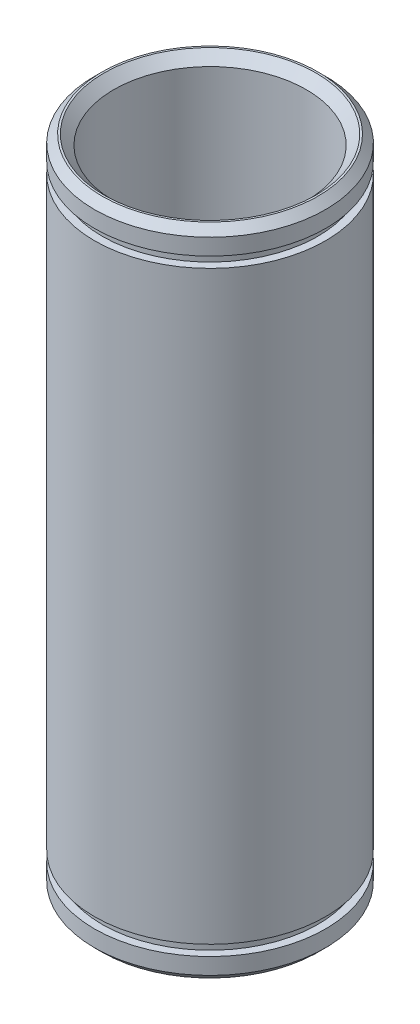
ISO-10303-21;
HEADER;
FILE_DESCRIPTION(('STEP AP214'),'2;1');
FILE_NAME('part.step','',(''),(''),'','','');
FILE_SCHEMA(('AUTOMOTIVE_DESIGN { 1 0 10303 214 1 1 1 1 }'));
ENDSEC;
DATA;
#1=APPLICATION_CONTEXT('core data for automotive mechanical design processes');
#2=APPLICATION_PROTOCOL_DEFINITION('international standard','automotive_design',2000,#1);
#3=PRODUCT_CONTEXT('',#1,'mechanical');
#4=PRODUCT('Part','Part','',(#3));
#5=PRODUCT_RELATED_PRODUCT_CATEGORY('part','',(#4));
#6=PRODUCT_DEFINITION_FORMATION('','',#4);
#7=PRODUCT_DEFINITION_CONTEXT('part definition',#1,'design');
#8=PRODUCT_DEFINITION('design','',#6,#7);
#9=PRODUCT_DEFINITION_SHAPE('','',#8);
#10=(LENGTH_UNIT() NAMED_UNIT(*) SI_UNIT(.MILLI.,.METRE.));
#11=(NAMED_UNIT(*) PLANE_ANGLE_UNIT() SI_UNIT($,.RADIAN.));
#12=(NAMED_UNIT(*) SI_UNIT($,.STERADIAN.) SOLID_ANGLE_UNIT());
#13=UNCERTAINTY_MEASURE_WITH_UNIT(LENGTH_MEASURE(1.E-05),#10,'distance_accuracy_value','');
#14=(GEOMETRIC_REPRESENTATION_CONTEXT(3) GLOBAL_UNCERTAINTY_ASSIGNED_CONTEXT((#13)) GLOBAL_UNIT_ASSIGNED_CONTEXT((#10,
#11,#12)) REPRESENTATION_CONTEXT('',''));
#15=CARTESIAN_POINT('',(0.,0.,0.));
#16=DIRECTION('',(0.,0.,1.));
#17=DIRECTION('',(1.,0.,0.));
#18=AXIS2_PLACEMENT_3D('',#15,#16,#17);
#19=CARTESIAN_POINT('',(0.,85.,0.));
#20=DIRECTION('',(0.,-1.,0.));
#21=DIRECTION('',(0.,0.,-1.));
#22=AXIS2_PLACEMENT_3D('',#19,#20,#21);
#23=CYLINDRICAL_SURFACE('',#22,15.);
#24=CARTESIAN_POINT('',(0.,80.5,0.));
#25=DIRECTION('',(0.,1.,0.));
#26=DIRECTION('',(0.,0.,1.));
#27=AXIS2_PLACEMENT_3D('',#24,#25,#26);
#28=CIRCLE('',#27,15.);
#29=CARTESIAN_POINT('',(0.,80.5,15.));
#30=VERTEX_POINT('',#29);
#31=EDGE_CURVE('E72',#30,#30,#28,.T.);
#32=ORIENTED_EDGE('',*,*,#31,.F.);
#33=EDGE_LOOP('',(#32));
#34=FACE_BOUND('',#33,.T.);
#35=CARTESIAN_POINT('',(0.,4.5,0.));
#36=DIRECTION('',(0.,1.,0.));
#37=DIRECTION('',(0.,0.,1.));
#38=AXIS2_PLACEMENT_3D('',#35,#36,#37);
#39=CIRCLE('',#38,15.);
#40=CARTESIAN_POINT('',(0.,4.5,15.));
#41=VERTEX_POINT('',#40);
#42=EDGE_CURVE('E80',#41,#41,#39,.T.);
#43=ORIENTED_EDGE('',*,*,#42,.T.);
#44=EDGE_LOOP('',(#43));
#45=FACE_BOUND('',#44,.T.);
#46=ADVANCED_FACE('F39',(#34,#45),#23,.T.);
#47=CARTESIAN_POINT('',(0.,1.00000000000001,0.));
#48=DIRECTION('',(0.,1.,0.));
#49=DIRECTION('',(0.,0.,1.));
#50=AXIS2_PLACEMENT_3D('',#47,#48,#49);
#51=CIRCLE('',#50,15.);
#52=CARTESIAN_POINT('',(0.,1.00000000000001,15.));
#53=VERTEX_POINT('',#52);
#54=EDGE_CURVE('E55',#53,#53,#51,.T.);
#55=ORIENTED_EDGE('',*,*,#54,.T.);
#56=EDGE_LOOP('',(#55));
#57=FACE_BOUND('',#56,.T.);
#58=CARTESIAN_POINT('',(0.,3.125,0.));
#59=DIRECTION('',(0.,1.,0.));
#60=DIRECTION('',(0.,0.,1.));
#61=AXIS2_PLACEMENT_3D('',#58,#59,#60);
#62=CIRCLE('',#61,15.);
#63=CARTESIAN_POINT('',(0.,3.125,15.));
#64=VERTEX_POINT('',#63);
#65=EDGE_CURVE('E85',#64,#64,#62,.T.);
#66=ORIENTED_EDGE('',*,*,#65,.F.);
#67=EDGE_LOOP('',(#66));
#68=FACE_BOUND('',#67,.T.);
#69=ADVANCED_FACE('F114',(#57,#68),#23,.T.);
#70=CARTESIAN_POINT('',(0.,85.,0.));
#71=DIRECTION('',(0.,1.,0.));
#72=DIRECTION('',(0.,0.,1.));
#73=AXIS2_PLACEMENT_3D('',#70,#71,#72);
#74=PLANE('',#73);
#75=CARTESIAN_POINT('',(0.,85.,0.));
#76=DIRECTION('',(0.,1.,0.));
#77=DIRECTION('',(0.,0.,1.));
#78=AXIS2_PLACEMENT_3D('',#75,#76,#77);
#79=CIRCLE('',#78,14.);
#80=CARTESIAN_POINT('',(0.,85.,14.));
#81=VERTEX_POINT('',#80);
#82=EDGE_CURVE('E47',#81,#81,#79,.T.);
#83=ORIENTED_EDGE('',*,*,#82,.T.);
#84=EDGE_LOOP('',(#83));
#85=FACE_BOUND('',#84,.T.);
#86=CARTESIAN_POINT('',(0.,85.,0.));
#87=DIRECTION('',(0.,1.,0.));
#88=DIRECTION('',(0.,0.,1.));
#89=AXIS2_PLACEMENT_3D('',#86,#87,#88);
#90=CIRCLE('',#89,13.75);
#91=CARTESIAN_POINT('',(0.,85.,13.75));
#92=VERTEX_POINT('',#91);
#93=EDGE_CURVE('E60',#92,#92,#90,.F.);
#94=ORIENTED_EDGE('',*,*,#93,.T.);
#95=EDGE_LOOP('',(#94));
#96=FACE_BOUND('',#95,.T.);
#97=ADVANCED_FACE('F116',(#85,#96),#74,.T.);
#98=CARTESIAN_POINT('',(0.,0.,0.));
#99=DIRECTION('',(0.,1.,0.));
#100=DIRECTION('',(0.,0.,1.));
#101=AXIS2_PLACEMENT_3D('',#98,#99,#100);
#102=PLANE('',#101);
#103=CARTESIAN_POINT('',(0.,0.,0.));
#104=DIRECTION('',(0.,1.,0.));
#105=DIRECTION('',(0.,0.,1.));
#106=AXIS2_PLACEMENT_3D('',#103,#104,#105);
#107=CIRCLE('',#106,14.);
#108=CARTESIAN_POINT('',(0.,0.,14.));
#109=VERTEX_POINT('',#108);
#110=EDGE_CURVE('E51',#109,#109,#107,.F.);
#111=ORIENTED_EDGE('',*,*,#110,.T.);
#112=EDGE_LOOP('',(#111));
#113=FACE_BOUND('',#112,.T.);
#114=CARTESIAN_POINT('',(0.,0.,0.));
#115=DIRECTION('',(0.,1.,0.));
#116=DIRECTION('',(0.,0.,1.));
#117=AXIS2_PLACEMENT_3D('',#114,#115,#116);
#118=CIRCLE('',#117,13.75);
#119=CARTESIAN_POINT('',(0.,0.,13.75));
#120=VERTEX_POINT('',#119);
#121=EDGE_CURVE('E69',#120,#120,#118,.T.);
#122=ORIENTED_EDGE('',*,*,#121,.T.);
#123=EDGE_LOOP('',(#122));
#124=FACE_BOUND('',#123,.T.);
#125=ADVANCED_FACE('F124',(#113,#124),#102,.F.);
#126=CARTESIAN_POINT('',(0.,84.,0.));
#127=DIRECTION('',(0.,1.,0.));
#128=DIRECTION('',(0.,0.,1.));
#129=AXIS2_PLACEMENT_3D('',#126,#127,#128);
#130=CIRCLE('',#129,15.);
#131=CARTESIAN_POINT('',(0.,84.,15.));
#132=VERTEX_POINT('',#131);
#133=EDGE_CURVE('E10',#132,#132,#130,.F.);
#134=ORIENTED_EDGE('',*,*,#133,.T.);
#135=EDGE_LOOP('',(#134));
#136=FACE_BOUND('',#135,.T.);
#137=CARTESIAN_POINT('',(0.,81.875,0.));
#138=DIRECTION('',(0.,1.,0.));
#139=DIRECTION('',(0.,0.,1.));
#140=AXIS2_PLACEMENT_3D('',#137,#138,#139);
#141=CIRCLE('',#140,15.);
#142=CARTESIAN_POINT('',(0.,81.875,15.));
#143=VERTEX_POINT('',#142);
#144=EDGE_CURVE('E73',#143,#143,#141,.T.);
#145=ORIENTED_EDGE('',*,*,#144,.T.);
#146=EDGE_LOOP('',(#145));
#147=FACE_BOUND('',#146,.T.);
#148=ADVANCED_FACE('F119',(#136,#147),#23,.T.);
#149=CARTESIAN_POINT('',(0.,85.,0.));
#150=DIRECTION('',(0.,-1.,0.));
#151=DIRECTION('',(0.,0.,-1.));
#152=AXIS2_PLACEMENT_3D('',#149,#150,#151);
#153=CYLINDRICAL_SURFACE('',#152,12.5);
#154=CARTESIAN_POINT('',(0.,1.25,0.));
#155=DIRECTION('',(0.,1.,0.));
#156=DIRECTION('',(0.,0.,1.));
#157=AXIS2_PLACEMENT_3D('',#154,#155,#156);
#158=CIRCLE('',#157,12.5);
#159=CARTESIAN_POINT('',(0.,1.25,12.5));
#160=VERTEX_POINT('',#159);
#161=EDGE_CURVE('E63',#160,#160,#158,.F.);
#162=ORIENTED_EDGE('',*,*,#161,.T.);
#163=EDGE_LOOP('',(#162));
#164=FACE_BOUND('',#163,.T.);
#165=CARTESIAN_POINT('',(0.,83.75,0.));
#166=DIRECTION('',(0.,1.,0.));
#167=DIRECTION('',(0.,0.,1.));
#168=AXIS2_PLACEMENT_3D('',#165,#166,#167);
#169=CIRCLE('',#168,12.5);
#170=CARTESIAN_POINT('',(0.,83.75,12.5));
#171=VERTEX_POINT('',#170);
#172=EDGE_CURVE('E66',#171,#171,#169,.T.);
#173=ORIENTED_EDGE('',*,*,#172,.T.);
#174=EDGE_LOOP('',(#173));
#175=FACE_BOUND('',#174,.T.);
#176=ADVANCED_FACE('F131',(#164,#175),#153,.F.);
#177=CARTESIAN_POINT('',(0.,80.5,0.));
#178=DIRECTION('',(0.,1.,0.));
#179=DIRECTION('',(0.,0.,1.));
#180=AXIS2_PLACEMENT_3D('',#177,#178,#179);
#181=CYLINDRICAL_SURFACE('',#180,14.);
#182=CARTESIAN_POINT('',(0.,80.5,0.));
#183=DIRECTION('',(0.,1.,0.));
#184=DIRECTION('',(0.,0.,1.));
#185=AXIS2_PLACEMENT_3D('',#182,#183,#184);
#186=CIRCLE('',#185,14.);
#187=CARTESIAN_POINT('',(0.,80.5,14.));
#188=VERTEX_POINT('',#187);
#189=EDGE_CURVE('E76',#188,#188,#186,.T.);
#190=ORIENTED_EDGE('',*,*,#189,.T.);
#191=EDGE_LOOP('',(#190));
#192=FACE_BOUND('',#191,.T.);
#193=CARTESIAN_POINT('',(0.,81.875,0.));
#194=DIRECTION('',(0.,1.,0.));
#195=DIRECTION('',(0.,0.,1.));
#196=AXIS2_PLACEMENT_3D('',#193,#194,#195);
#197=CIRCLE('',#196,14.);
#198=CARTESIAN_POINT('',(0.,81.875,14.));
#199=VERTEX_POINT('',#198);
#200=EDGE_CURVE('E77',#199,#199,#197,.T.);
#201=ORIENTED_EDGE('',*,*,#200,.F.);
#202=EDGE_LOOP('',(#201));
#203=FACE_BOUND('',#202,.T.);
#204=ADVANCED_FACE('F137',(#192,#203),#181,.T.);
#205=CARTESIAN_POINT('',(0.,80.5,0.));
#206=DIRECTION('',(0.,1.,0.));
#207=DIRECTION('',(0.,0.,1.));
#208=AXIS2_PLACEMENT_3D('',#205,#206,#207);
#209=PLANE('',#208);
#210=ORIENTED_EDGE('',*,*,#189,.F.);
#211=EDGE_LOOP('',(#210));
#212=FACE_BOUND('',#211,.T.);
#213=ORIENTED_EDGE('',*,*,#31,.T.);
#214=EDGE_LOOP('',(#213));
#215=FACE_BOUND('',#214,.T.);
#216=ADVANCED_FACE('F145',(#212,#215),#209,.T.);
#217=CARTESIAN_POINT('',(0.,81.875,0.));
#218=DIRECTION('',(0.,1.,0.));
#219=DIRECTION('',(0.,0.,1.));
#220=AXIS2_PLACEMENT_3D('',#217,#218,#219);
#221=PLANE('',#220);
#222=ORIENTED_EDGE('',*,*,#200,.T.);
#223=EDGE_LOOP('',(#222));
#224=FACE_BOUND('',#223,.T.);
#225=ORIENTED_EDGE('',*,*,#144,.F.);
#226=EDGE_LOOP('',(#225));
#227=FACE_BOUND('',#226,.T.);
#228=ADVANCED_FACE('F103',(#224,#227),#221,.F.);
#229=CARTESIAN_POINT('',(0.,4.5,0.));
#230=DIRECTION('',(0.,-1.,0.));
#231=DIRECTION('',(0.,0.,-1.));
#232=AXIS2_PLACEMENT_3D('',#229,#230,#231);
#233=CYLINDRICAL_SURFACE('',#232,14.);
#234=CARTESIAN_POINT('',(0.,4.5,0.));
#235=DIRECTION('',(0.,1.,0.));
#236=DIRECTION('',(0.,0.,1.));
#237=AXIS2_PLACEMENT_3D('',#234,#235,#236);
#238=CIRCLE('',#237,14.);
#239=CARTESIAN_POINT('',(0.,4.5,14.));
#240=VERTEX_POINT('',#239);
#241=EDGE_CURVE('E88',#240,#240,#238,.T.);
#242=ORIENTED_EDGE('',*,*,#241,.F.);
#243=EDGE_LOOP('',(#242));
#244=FACE_BOUND('',#243,.T.);
#245=CARTESIAN_POINT('',(0.,3.125,0.));
#246=DIRECTION('',(0.,1.,0.));
#247=DIRECTION('',(0.,0.,1.));
#248=AXIS2_PLACEMENT_3D('',#245,#246,#247);
#249=CIRCLE('',#248,14.);
#250=CARTESIAN_POINT('',(0.,3.125,14.));
#251=VERTEX_POINT('',#250);
#252=EDGE_CURVE('E89',#251,#251,#249,.T.);
#253=ORIENTED_EDGE('',*,*,#252,.T.);
#254=EDGE_LOOP('',(#253));
#255=FACE_BOUND('',#254,.T.);
#256=ADVANCED_FACE('F100',(#244,#255),#233,.T.);
#257=CARTESIAN_POINT('',(0.,4.5,0.));
#258=DIRECTION('',(0.,-1.,0.));
#259=DIRECTION('',(0.,0.,1.));
#260=AXIS2_PLACEMENT_3D('',#257,#258,#259);
#261=PLANE('',#260);
#262=ORIENTED_EDGE('',*,*,#241,.T.);
#263=EDGE_LOOP('',(#262));
#264=FACE_BOUND('',#263,.T.);
#265=ORIENTED_EDGE('',*,*,#42,.F.);
#266=EDGE_LOOP('',(#265));
#267=FACE_BOUND('',#266,.T.);
#268=ADVANCED_FACE('F97',(#264,#267),#261,.T.);
#269=CARTESIAN_POINT('',(0.,3.125,0.));
#270=DIRECTION('',(0.,-1.,0.));
#271=DIRECTION('',(0.,0.,1.));
#272=AXIS2_PLACEMENT_3D('',#269,#270,#271);
#273=PLANE('',#272);
#274=ORIENTED_EDGE('',*,*,#252,.F.);
#275=EDGE_LOOP('',(#274));
#276=FACE_BOUND('',#275,.T.);
#277=ORIENTED_EDGE('',*,*,#65,.T.);
#278=EDGE_LOOP('',(#277));
#279=FACE_BOUND('',#278,.T.);
#280=ADVANCED_FACE('F107',(#276,#279),#273,.F.);
#281=CARTESIAN_POINT('',(0.,0.,0.));
#282=DIRECTION('',(0.,-1.,0.));
#283=DIRECTION('',(0.,0.,-1.));
#284=AXIS2_PLACEMENT_3D('',#281,#282,#283);
#285=CONICAL_SURFACE('',#284,13.75,0.785398163397444);
#286=ORIENTED_EDGE('',*,*,#161,.F.);
#287=EDGE_LOOP('',(#286));
#288=FACE_BOUND('',#287,.T.);
#289=ORIENTED_EDGE('',*,*,#121,.F.);
#290=EDGE_LOOP('',(#289));
#291=FACE_BOUND('',#290,.T.);
#292=ADVANCED_FACE('F110',(#288,#291),#285,.F.);
#293=CARTESIAN_POINT('',(0.,83.75,0.));
#294=DIRECTION('',(0.,1.,0.));
#295=DIRECTION('',(0.,0.,1.));
#296=AXIS2_PLACEMENT_3D('',#293,#294,#295);
#297=CONICAL_SURFACE('',#296,12.5,0.785398163397441);
#298=ORIENTED_EDGE('',*,*,#93,.F.);
#299=EDGE_LOOP('',(#298));
#300=FACE_BOUND('',#299,.T.);
#301=ORIENTED_EDGE('',*,*,#172,.F.);
#302=EDGE_LOOP('',(#301));
#303=FACE_BOUND('',#302,.T.);
#304=ADVANCED_FACE('F187',(#300,#303),#297,.F.);
#305=CARTESIAN_POINT('',(0.,1.00000000000001,0.));
#306=DIRECTION('',(0.,1.,0.));
#307=DIRECTION('',(0.,0.,1.));
#308=AXIS2_PLACEMENT_3D('',#305,#306,#307);
#309=CONICAL_SURFACE('',#308,15.,0.785398163397451);
#310=ORIENTED_EDGE('',*,*,#110,.F.);
#311=EDGE_LOOP('',(#310));
#312=FACE_BOUND('',#311,.T.);
#313=ORIENTED_EDGE('',*,*,#54,.F.);
#314=EDGE_LOOP('',(#313));
#315=FACE_BOUND('',#314,.T.);
#316=ADVANCED_FACE('F194',(#312,#315),#309,.T.);
#317=CARTESIAN_POINT('',(0.,85.,0.));
#318=DIRECTION('',(0.,-1.,0.));
#319=DIRECTION('',(0.,0.,-1.));
#320=AXIS2_PLACEMENT_3D('',#317,#318,#319);
#321=CONICAL_SURFACE('',#320,14.,0.785398163397442);
#322=ORIENTED_EDGE('',*,*,#133,.F.);
#323=EDGE_LOOP('',(#322));
#324=FACE_BOUND('',#323,.T.);
#325=ORIENTED_EDGE('',*,*,#82,.F.);
#326=EDGE_LOOP('',(#325));
#327=FACE_BOUND('',#326,.T.);
#328=ADVANCED_FACE('F42',(#324,#327),#321,.T.);
#329=CLOSED_SHELL('',(#46,#69,#97,#125,#148,#176,#204,#216,#228,#256,#268,#280,#292,#304,#316,#328));
#330=MANIFOLD_SOLID_BREP('B2',#329);
#331=ADVANCED_BREP_SHAPE_REPRESENTATION('',(#18,#330),#14);
#332=SHAPE_DEFINITION_REPRESENTATION(#9,#331);
ENDSEC;
END-ISO-10303-21;
